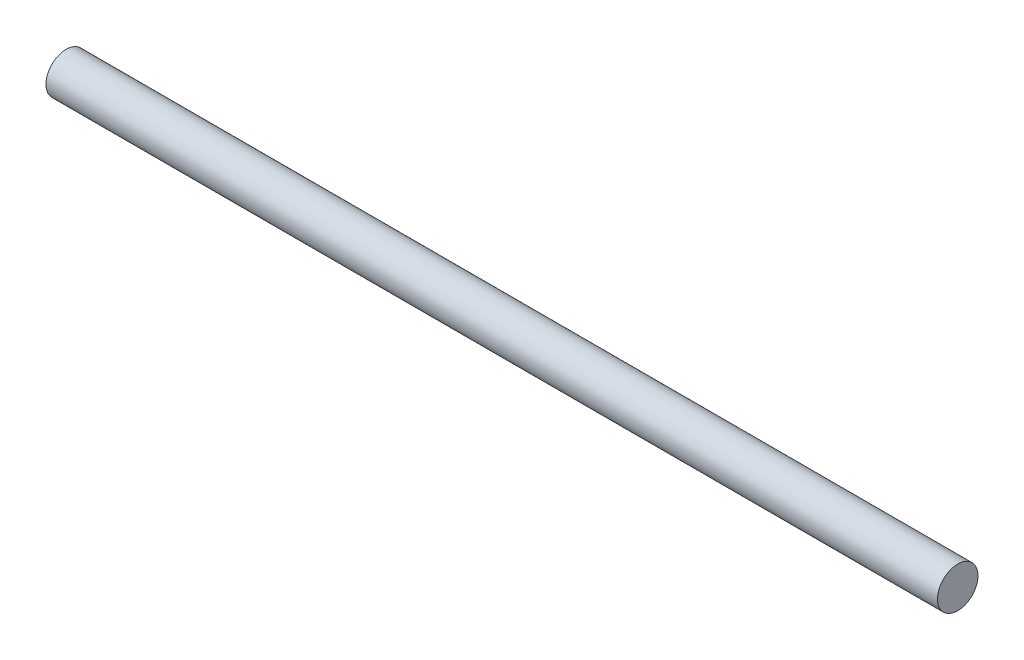
ISO-10303-21;
HEADER;
FILE_DESCRIPTION(('STEP AP214'),'2;1');
FILE_NAME('part.step','',(''),(''),'','','');
FILE_SCHEMA(('AUTOMOTIVE_DESIGN { 1 0 10303 214 1 1 1 1 }'));
ENDSEC;
DATA;
#1=APPLICATION_CONTEXT('core data for automotive mechanical design processes');
#2=APPLICATION_PROTOCOL_DEFINITION('international standard','automotive_design',2000,#1);
#3=PRODUCT_CONTEXT('',#1,'mechanical');
#4=PRODUCT('Part','Part','',(#3));
#5=PRODUCT_RELATED_PRODUCT_CATEGORY('part','',(#4));
#6=PRODUCT_DEFINITION_FORMATION('','',#4);
#7=PRODUCT_DEFINITION_CONTEXT('part definition',#1,'design');
#8=PRODUCT_DEFINITION('design','',#6,#7);
#9=PRODUCT_DEFINITION_SHAPE('','',#8);
#10=(LENGTH_UNIT() NAMED_UNIT(*) SI_UNIT(.MILLI.,.METRE.));
#11=(NAMED_UNIT(*) PLANE_ANGLE_UNIT() SI_UNIT($,.RADIAN.));
#12=(NAMED_UNIT(*) SI_UNIT($,.STERADIAN.) SOLID_ANGLE_UNIT());
#13=UNCERTAINTY_MEASURE_WITH_UNIT(LENGTH_MEASURE(1.E-05),#10,'distance_accuracy_value','');
#14=(GEOMETRIC_REPRESENTATION_CONTEXT(3) GLOBAL_UNCERTAINTY_ASSIGNED_CONTEXT((#13)) GLOBAL_UNIT_ASSIGNED_CONTEXT((#10,
#11,#12)) REPRESENTATION_CONTEXT('',''));
#15=CARTESIAN_POINT('',(0.,0.,0.));
#16=DIRECTION('',(0.,0.,1.));
#17=DIRECTION('',(1.,0.,0.));
#18=AXIS2_PLACEMENT_3D('',#15,#16,#17);
#19=CARTESIAN_POINT('',(69.85,0.,0.));
#20=DIRECTION('',(-1.,0.,0.));
#21=DIRECTION('',(0.,0.,1.));
#22=AXIS2_PLACEMENT_3D('',#19,#20,#21);
#23=CYLINDRICAL_SURFACE('',#22,3.175);
#24=CARTESIAN_POINT('',(69.85,0.,0.));
#25=DIRECTION('',(1.,0.,0.));
#26=DIRECTION('',(0.,0.,-1.));
#27=AXIS2_PLACEMENT_3D('',#24,#25,#26);
#28=CIRCLE('',#27,3.175);
#29=CARTESIAN_POINT('',(69.85,0.,-3.175));
#30=VERTEX_POINT('',#29);
#31=EDGE_CURVE('E10',#30,#30,#28,.T.);
#32=ORIENTED_EDGE('',*,*,#31,.F.);
#33=EDGE_LOOP('',(#32));
#34=FACE_BOUND('',#33,.T.);
#35=CARTESIAN_POINT('',(-69.85,0.,0.));
#36=DIRECTION('',(1.,0.,0.));
#37=DIRECTION('',(0.,0.,-1.));
#38=AXIS2_PLACEMENT_3D('',#35,#36,#37);
#39=CIRCLE('',#38,3.175);
#40=CARTESIAN_POINT('',(-69.85,0.,-3.175));
#41=VERTEX_POINT('',#40);
#42=EDGE_CURVE('E40',#41,#41,#39,.T.);
#43=ORIENTED_EDGE('',*,*,#42,.T.);
#44=EDGE_LOOP('',(#43));
#45=FACE_BOUND('',#44,.T.);
#46=ADVANCED_FACE('F37',(#34,#45),#23,.T.);
#47=CARTESIAN_POINT('',(69.85,0.,0.));
#48=DIRECTION('',(1.,0.,0.));
#49=DIRECTION('',(0.,0.,-1.));
#50=AXIS2_PLACEMENT_3D('',#47,#48,#49);
#51=PLANE('',#50);
#52=ORIENTED_EDGE('',*,*,#31,.T.);
#53=EDGE_LOOP('',(#52));
#54=FACE_BOUND('',#53,.T.);
#55=ADVANCED_FACE('F54',(#54),#51,.T.);
#56=CARTESIAN_POINT('',(-69.85,0.,0.));
#57=DIRECTION('',(1.,0.,0.));
#58=DIRECTION('',(0.,0.,-1.));
#59=AXIS2_PLACEMENT_3D('',#56,#57,#58);
#60=PLANE('',#59);
#61=ORIENTED_EDGE('',*,*,#42,.F.);
#62=EDGE_LOOP('',(#61));
#63=FACE_BOUND('',#62,.T.);
#64=ADVANCED_FACE('F52',(#63),#60,.F.);
#65=CLOSED_SHELL('',(#46,#55,#64));
#66=MANIFOLD_SOLID_BREP('B2',#65);
#67=ADVANCED_BREP_SHAPE_REPRESENTATION('',(#18,#66),#14);
#68=SHAPE_DEFINITION_REPRESENTATION(#9,#67);
ENDSEC;
END-ISO-10303-21;
